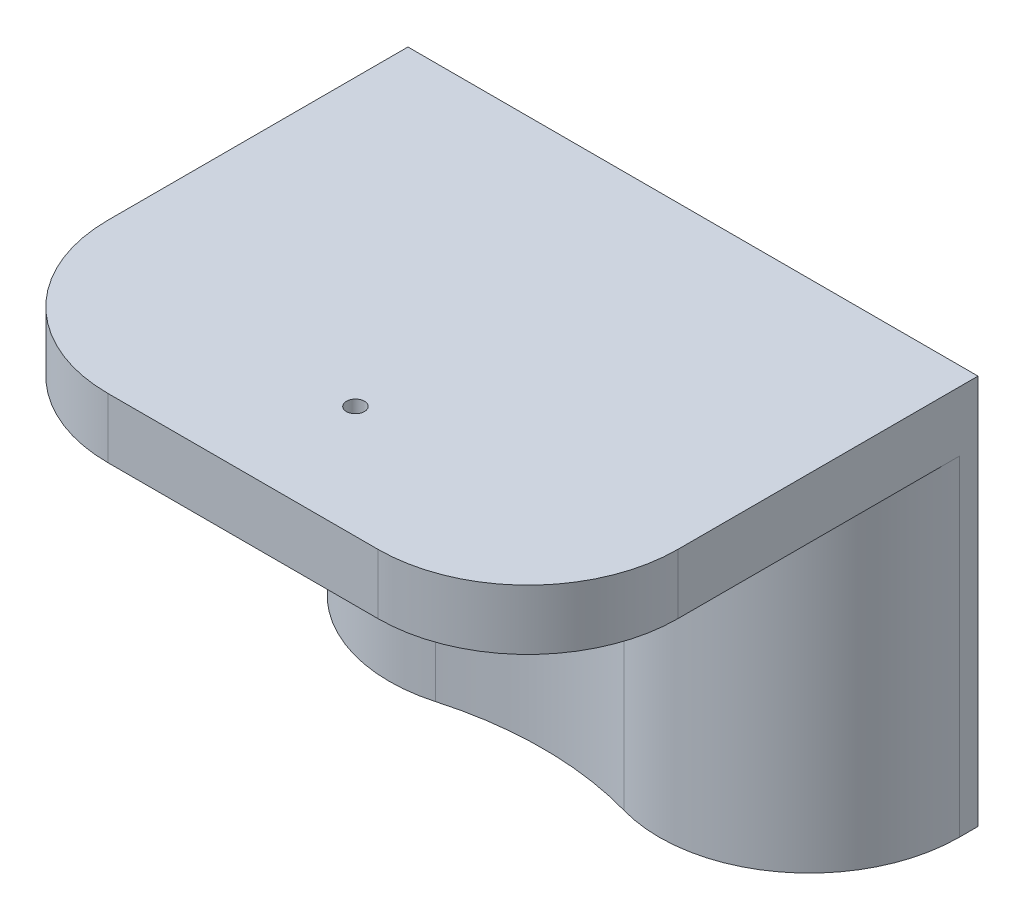
ISO-10303-21;
HEADER;
FILE_DESCRIPTION(('STEP AP214'),'2;1');
FILE_NAME('part.step','',(''),(''),'','','');
FILE_SCHEMA(('AUTOMOTIVE_DESIGN { 1 0 10303 214 1 1 1 1 }'));
ENDSEC;
DATA;
#1=APPLICATION_CONTEXT('core data for automotive mechanical design processes');
#2=APPLICATION_PROTOCOL_DEFINITION('international standard','automotive_design',2000,#1);
#3=PRODUCT_CONTEXT('',#1,'mechanical');
#4=PRODUCT('Part','Part','',(#3));
#5=PRODUCT_RELATED_PRODUCT_CATEGORY('part','',(#4));
#6=PRODUCT_DEFINITION_FORMATION('','',#4);
#7=PRODUCT_DEFINITION_CONTEXT('part definition',#1,'design');
#8=PRODUCT_DEFINITION('design','',#6,#7);
#9=PRODUCT_DEFINITION_SHAPE('','',#8);
#10=(LENGTH_UNIT() NAMED_UNIT(*) SI_UNIT(.MILLI.,.METRE.));
#11=(NAMED_UNIT(*) PLANE_ANGLE_UNIT() SI_UNIT($,.RADIAN.));
#12=(NAMED_UNIT(*) SI_UNIT($,.STERADIAN.) SOLID_ANGLE_UNIT());
#13=UNCERTAINTY_MEASURE_WITH_UNIT(LENGTH_MEASURE(1.E-05),#10,'distance_accuracy_value','');
#14=(GEOMETRIC_REPRESENTATION_CONTEXT(3) GLOBAL_UNCERTAINTY_ASSIGNED_CONTEXT((#13)) GLOBAL_UNIT_ASSIGNED_CONTEXT((#10,
#11,#12)) REPRESENTATION_CONTEXT('',''));
#15=CARTESIAN_POINT('',(0.,0.,0.));
#16=DIRECTION('',(0.,0.,1.));
#17=DIRECTION('',(1.,0.,0.));
#18=AXIS2_PLACEMENT_3D('',#15,#16,#17);
#19=CARTESIAN_POINT('',(-33.1070823408573,4.,37.625158927755));
#20=DIRECTION('',(0.,-1.,0.));
#21=DIRECTION('',(0.,0.,-1.));
#22=AXIS2_PLACEMENT_3D('',#19,#20,#21);
#23=PLANE('',#22);
#24=DIRECTION('',(0.,0.,1.));
#25=VECTOR('',#24,1.);
#26=CARTESIAN_POINT('',(-43.1070823408573,4.,17.625158927755));
#27=LINE('',#26,#25);
#28=CARTESIAN_POINT('',(-43.1070823408573,4.,17.625158927755));
#29=VERTEX_POINT('',#28);
#30=CARTESIAN_POINT('',(-43.1070823408573,4.,37.625158927755));
#31=VERTEX_POINT('',#30);
#32=EDGE_CURVE('E127',#29,#31,#27,.T.);
#33=ORIENTED_EDGE('',*,*,#32,.T.);
#34=CARTESIAN_POINT('',(-33.1070823408573,4.,37.625158927755));
#35=DIRECTION('',(0.,1.,0.));
#36=DIRECTION('',(0.,0.,-1.));
#37=AXIS2_PLACEMENT_3D('',#34,#35,#36);
#38=CIRCLE('',#37,10.);
#39=CARTESIAN_POINT('',(-33.1070823408572,4.,47.625158927755));
#40=VERTEX_POINT('',#39);
#41=EDGE_CURVE('E150',#31,#40,#38,.T.);
#42=ORIENTED_EDGE('',*,*,#41,.T.);
#43=DIRECTION('',(1.,0.,0.));
#44=VECTOR('',#43,1.);
#45=CARTESIAN_POINT('',(-33.1070823408572,4.,47.625158927755));
#46=LINE('',#45,#44);
#47=CARTESIAN_POINT('',(-15.1070823408574,4.,47.625158927755));
#48=VERTEX_POINT('',#47);
#49=EDGE_CURVE('E153',#40,#48,#46,.T.);
#50=ORIENTED_EDGE('',*,*,#49,.T.);
#51=CARTESIAN_POINT('',(-15.1070823408573,4.,37.625158927755));
#52=DIRECTION('',(0.,1.,0.));
#53=DIRECTION('',(0.,0.,1.));
#54=AXIS2_PLACEMENT_3D('',#51,#52,#53);
#55=CIRCLE('',#54,10.);
#56=CARTESIAN_POINT('',(-5.10708234085731,4.,37.625158927755));
#57=VERTEX_POINT('',#56);
#58=EDGE_CURVE('E155',#48,#57,#55,.T.);
#59=ORIENTED_EDGE('',*,*,#58,.T.);
#60=DIRECTION('',(0.,0.,-1.));
#61=VECTOR('',#60,1.);
#62=CARTESIAN_POINT('',(-5.10708234085731,4.,17.625158927755));
#63=LINE('',#62,#61);
#64=CARTESIAN_POINT('',(-5.10708234085731,4.,17.625158927755));
#65=VERTEX_POINT('',#64);
#66=EDGE_CURVE('E157',#57,#65,#63,.T.);
#67=ORIENTED_EDGE('',*,*,#66,.T.);
#68=DIRECTION('',(-1.,0.,0.));
#69=VECTOR('',#68,1.);
#70=CARTESIAN_POINT('',(-43.1070823408573,4.,17.625158927755));
#71=LINE('',#70,#69);
#72=EDGE_CURVE('E131',#65,#29,#71,.T.);
#73=ORIENTED_EDGE('',*,*,#72,.T.);
#74=EDGE_LOOP('',(#33,#42,#50,#59,#67,#73));
#75=FACE_BOUND('',#74,.T.);
#76=CARTESIAN_POINT('',(-24.1070823408573,4.,40.125158927755));
#77=DIRECTION('',(0.,1.,0.));
#78=DIRECTION('',(0.,0.,1.));
#79=AXIS2_PLACEMENT_3D('',#76,#77,#78);
#80=CIRCLE('',#79,0.600000000000001);
#81=CARTESIAN_POINT('',(-24.1070823408573,4.,40.725158927755));
#82=VERTEX_POINT('',#81);
#83=EDGE_CURVE('E143',#82,#82,#80,.T.);
#84=ORIENTED_EDGE('',*,*,#83,.F.);
#85=EDGE_LOOP('',(#84));
#86=FACE_BOUND('',#85,.T.);
#87=ADVANCED_FACE('F33',(#75,#86),#23,.F.);
#88=CARTESIAN_POINT('',(-33.1070823408573,0.,37.625158927755));
#89=DIRECTION('',(0.,-1.,0.));
#90=DIRECTION('',(0.,0.,-1.));
#91=AXIS2_PLACEMENT_3D('',#88,#89,#90);
#92=PLANE('',#91);
#93=CARTESIAN_POINT('',(-24.1070823408573,0.,50.675158927755));
#94=DIRECTION('',(0.,1.,0.));
#95=DIRECTION('',(0.,0.,-1.));
#96=AXIS2_PLACEMENT_3D('',#93,#94,#95);
#97=CIRCLE('',#96,23.05);
#98=CARTESIAN_POINT('',(-17.8302290882098,0.,28.4962587466205));
#99=VERTEX_POINT('',#98);
#100=CARTESIAN_POINT('',(-30.3839355935048,0.,28.4962587466205));
#101=VERTEX_POINT('',#100);
#102=EDGE_CURVE('E119',#99,#101,#97,.T.);
#103=ORIENTED_EDGE('',*,*,#102,.F.);
#104=CARTESIAN_POINT('',(-15.1070823408573,0.,18.8741762385361));
#105=DIRECTION('',(0.,-1.,0.));
#106=DIRECTION('',(0.,0.,-1.));
#107=AXIS2_PLACEMENT_3D('',#104,#105,#106);
#108=CIRCLE('',#107,10.);
#109=CARTESIAN_POINT('',(-5.10708234085731,0.,18.8741762385361));
#110=VERTEX_POINT('',#109);
#111=EDGE_CURVE('E11',#99,#110,#108,.F.);
#112=ORIENTED_EDGE('',*,*,#111,.T.);
#113=DIRECTION('',(0.,0.,-1.));
#114=VECTOR('',#113,1.);
#115=CARTESIAN_POINT('',(-5.10708234085731,0.,37.625158927755));
#116=LINE('',#115,#114);
#117=CARTESIAN_POINT('',(-5.10708234085731,0.,37.625158927755));
#118=VERTEX_POINT('',#117);
#119=EDGE_CURVE('E47',#118,#110,#116,.T.);
#120=ORIENTED_EDGE('',*,*,#119,.F.);
#121=CARTESIAN_POINT('',(-15.1070823408573,0.,37.625158927755));
#122=DIRECTION('',(0.,1.,0.));
#123=DIRECTION('',(0.,0.,1.));
#124=AXIS2_PLACEMENT_3D('',#121,#122,#123);
#125=CIRCLE('',#124,10.);
#126=CARTESIAN_POINT('',(-15.1070823408574,0.,47.625158927755));
#127=VERTEX_POINT('',#126);
#128=EDGE_CURVE('E151',#127,#118,#125,.T.);
#129=ORIENTED_EDGE('',*,*,#128,.F.);
#130=DIRECTION('',(1.,0.,0.));
#131=VECTOR('',#130,1.);
#132=CARTESIAN_POINT('',(-33.1070823408572,0.,47.625158927755));
#133=LINE('',#132,#131);
#134=CARTESIAN_POINT('',(-33.1070823408572,0.,47.625158927755));
#135=VERTEX_POINT('',#134);
#136=EDGE_CURVE('E161',#135,#127,#133,.T.);
#137=ORIENTED_EDGE('',*,*,#136,.F.);
#138=CARTESIAN_POINT('',(-33.1070823408573,0.,37.625158927755));
#139=DIRECTION('',(0.,1.,0.));
#140=DIRECTION('',(0.,0.,-1.));
#141=AXIS2_PLACEMENT_3D('',#138,#139,#140);
#142=CIRCLE('',#141,10.);
#143=CARTESIAN_POINT('',(-43.1070823408573,0.,37.625158927755));
#144=VERTEX_POINT('',#143);
#145=EDGE_CURVE('E146',#144,#135,#142,.T.);
#146=ORIENTED_EDGE('',*,*,#145,.F.);
#147=DIRECTION('',(0.,0.,1.));
#148=VECTOR('',#147,1.);
#149=CARTESIAN_POINT('',(-43.1070823408573,0.,37.625158927755));
#150=LINE('',#149,#148);
#151=CARTESIAN_POINT('',(-43.1070823408573,0.,18.8741762385361));
#152=VERTEX_POINT('',#151);
#153=EDGE_CURVE('E177',#152,#144,#150,.T.);
#154=ORIENTED_EDGE('',*,*,#153,.F.);
#155=CARTESIAN_POINT('',(-33.1070823408573,0.,18.8741762385361));
#156=DIRECTION('',(0.,-1.,0.));
#157=DIRECTION('',(0.,0.,-1.));
#158=AXIS2_PLACEMENT_3D('',#155,#156,#157);
#159=CIRCLE('',#158,10.);
#160=EDGE_CURVE('E185',#152,#101,#159,.F.);
#161=ORIENTED_EDGE('',*,*,#160,.T.);
#162=EDGE_LOOP('',(#103,#112,#120,#129,#137,#146,#154,#161));
#163=FACE_BOUND('',#162,.T.);
#164=CARTESIAN_POINT('',(-24.1070823408573,0.,40.125158927755));
#165=DIRECTION('',(0.,1.,0.));
#166=DIRECTION('',(0.,0.,1.));
#167=AXIS2_PLACEMENT_3D('',#164,#165,#166);
#168=CIRCLE('',#167,0.600000000000001);
#169=CARTESIAN_POINT('',(-24.1070823408573,0.,40.725158927755));
#170=VERTEX_POINT('',#169);
#171=EDGE_CURVE('E141',#170,#170,#168,.T.);
#172=ORIENTED_EDGE('',*,*,#171,.T.);
#173=EDGE_LOOP('',(#172));
#174=FACE_BOUND('',#173,.T.);
#175=ADVANCED_FACE('F210',(#163,#174),#92,.T.);
#176=CARTESIAN_POINT('',(-43.1070823408573,4.,17.625158927755));
#177=DIRECTION('',(1.,0.,0.));
#178=DIRECTION('',(0.,0.,-1.));
#179=AXIS2_PLACEMENT_3D('',#176,#177,#178);
#180=PLANE('',#179);
#181=DIRECTION('',(0.,0.,-1.));
#182=VECTOR('',#181,1.);
#183=CARTESIAN_POINT('',(-43.1070823408573,-22.,17.625158927755));
#184=LINE('',#183,#182);
#185=CARTESIAN_POINT('',(-43.1070823408573,-22.,18.8741762385361));
#186=VERTEX_POINT('',#185);
#187=CARTESIAN_POINT('',(-43.1070823408573,-22.,17.625158927755));
#188=VERTEX_POINT('',#187);
#189=EDGE_CURVE('E107',#186,#188,#184,.T.);
#190=ORIENTED_EDGE('',*,*,#189,.F.);
#191=DIRECTION('',(0.,1.,0.));
#192=VECTOR('',#191,1.);
#193=CARTESIAN_POINT('',(-43.1070823408573,4.,18.8741762385361));
#194=LINE('',#193,#192);
#195=EDGE_CURVE('E179',#186,#152,#194,.T.);
#196=ORIENTED_EDGE('',*,*,#195,.T.);
#197=ORIENTED_EDGE('',*,*,#153,.T.);
#198=DIRECTION('',(0.,-1.,0.));
#199=VECTOR('',#198,1.);
#200=CARTESIAN_POINT('',(-43.1070823408573,4.,37.625158927755));
#201=LINE('',#200,#199);
#202=EDGE_CURVE('E174',#31,#144,#201,.T.);
#203=ORIENTED_EDGE('',*,*,#202,.F.);
#204=ORIENTED_EDGE('',*,*,#32,.F.);
#205=DIRECTION('',(0.,-1.,0.));
#206=VECTOR('',#205,1.);
#207=CARTESIAN_POINT('',(-43.1070823408573,4.,17.625158927755));
#208=LINE('',#207,#206);
#209=EDGE_CURVE('E123',#29,#188,#208,.T.);
#210=ORIENTED_EDGE('',*,*,#209,.T.);
#211=EDGE_LOOP('',(#190,#196,#197,#203,#204,#210));
#212=FACE_BOUND('',#211,.T.);
#213=ADVANCED_FACE('F124',(#212),#180,.F.);
#214=CARTESIAN_POINT('',(-33.1070823408573,4.,37.625158927755));
#215=DIRECTION('',(0.,-1.,0.));
#216=DIRECTION('',(0.,0.,-1.));
#217=AXIS2_PLACEMENT_3D('',#214,#215,#216);
#218=CYLINDRICAL_SURFACE('',#217,10.);
#219=ORIENTED_EDGE('',*,*,#145,.T.);
#220=DIRECTION('',(0.,-1.,0.));
#221=VECTOR('',#220,1.);
#222=CARTESIAN_POINT('',(-33.1070823408572,4.,47.625158927755));
#223=LINE('',#222,#221);
#224=EDGE_CURVE('E171',#40,#135,#223,.T.);
#225=ORIENTED_EDGE('',*,*,#224,.F.);
#226=ORIENTED_EDGE('',*,*,#41,.F.);
#227=ORIENTED_EDGE('',*,*,#202,.T.);
#228=EDGE_LOOP('',(#219,#225,#226,#227));
#229=FACE_BOUND('',#228,.T.);
#230=ADVANCED_FACE('F219',(#229),#218,.T.);
#231=CARTESIAN_POINT('',(-33.1070823408572,4.,47.625158927755));
#232=DIRECTION('',(0.,0.,-1.));
#233=DIRECTION('',(-1.,0.,0.));
#234=AXIS2_PLACEMENT_3D('',#231,#232,#233);
#235=PLANE('',#234);
#236=ORIENTED_EDGE('',*,*,#136,.T.);
#237=DIRECTION('',(0.,-1.,0.));
#238=VECTOR('',#237,1.);
#239=CARTESIAN_POINT('',(-15.1070823408574,4.,47.625158927755));
#240=LINE('',#239,#238);
#241=EDGE_CURVE('E168',#48,#127,#240,.T.);
#242=ORIENTED_EDGE('',*,*,#241,.F.);
#243=ORIENTED_EDGE('',*,*,#49,.F.);
#244=ORIENTED_EDGE('',*,*,#224,.T.);
#245=EDGE_LOOP('',(#236,#242,#243,#244));
#246=FACE_BOUND('',#245,.T.);
#247=ADVANCED_FACE('F215',(#246),#235,.F.);
#248=CARTESIAN_POINT('',(-15.1070823408573,4.,37.625158927755));
#249=DIRECTION('',(0.,-1.,0.));
#250=DIRECTION('',(0.,0.,-1.));
#251=AXIS2_PLACEMENT_3D('',#248,#249,#250);
#252=CYLINDRICAL_SURFACE('',#251,10.);
#253=ORIENTED_EDGE('',*,*,#128,.T.);
#254=DIRECTION('',(0.,-1.,0.));
#255=VECTOR('',#254,1.);
#256=CARTESIAN_POINT('',(-5.10708234085731,4.,37.625158927755));
#257=LINE('',#256,#255);
#258=EDGE_CURVE('E166',#57,#118,#257,.T.);
#259=ORIENTED_EDGE('',*,*,#258,.F.);
#260=ORIENTED_EDGE('',*,*,#58,.F.);
#261=ORIENTED_EDGE('',*,*,#241,.T.);
#262=EDGE_LOOP('',(#253,#259,#260,#261));
#263=FACE_BOUND('',#262,.T.);
#264=ADVANCED_FACE('F207',(#263),#252,.T.);
#265=CARTESIAN_POINT('',(-5.10708234085731,4.,17.625158927755));
#266=DIRECTION('',(-1.,0.,0.));
#267=DIRECTION('',(0.,0.,1.));
#268=AXIS2_PLACEMENT_3D('',#265,#266,#267);
#269=PLANE('',#268);
#270=ORIENTED_EDGE('',*,*,#258,.T.);
#271=ORIENTED_EDGE('',*,*,#119,.T.);
#272=DIRECTION('',(0.,1.,0.));
#273=VECTOR('',#272,1.);
#274=CARTESIAN_POINT('',(-5.10708234085731,4.,18.8741762385361));
#275=LINE('',#274,#273);
#276=CARTESIAN_POINT('',(-5.10708234085731,-22.,18.8741762385361));
#277=VERTEX_POINT('',#276);
#278=EDGE_CURVE('E191',#110,#277,#275,.F.);
#279=ORIENTED_EDGE('',*,*,#278,.T.);
#280=DIRECTION('',(0.,0.,1.));
#281=VECTOR('',#280,1.);
#282=CARTESIAN_POINT('',(-5.10708234085731,-22.,17.625158927755));
#283=LINE('',#282,#281);
#284=CARTESIAN_POINT('',(-5.10708234085731,-22.,17.625158927755));
#285=VERTEX_POINT('',#284);
#286=EDGE_CURVE('E135',#285,#277,#283,.T.);
#287=ORIENTED_EDGE('',*,*,#286,.F.);
#288=DIRECTION('',(0.,-1.,0.));
#289=VECTOR('',#288,1.);
#290=CARTESIAN_POINT('',(-5.10708234085731,4.,17.625158927755));
#291=LINE('',#290,#289);
#292=EDGE_CURVE('E130',#65,#285,#291,.T.);
#293=ORIENTED_EDGE('',*,*,#292,.F.);
#294=ORIENTED_EDGE('',*,*,#66,.F.);
#295=EDGE_LOOP('',(#270,#271,#279,#287,#293,#294));
#296=FACE_BOUND('',#295,.T.);
#297=ADVANCED_FACE('F202',(#296),#269,.F.);
#298=CARTESIAN_POINT('',(-43.1070823408573,4.,17.625158927755));
#299=DIRECTION('',(0.,0.,1.));
#300=DIRECTION('',(1.,0.,0.));
#301=AXIS2_PLACEMENT_3D('',#298,#299,#300);
#302=PLANE('',#301);
#303=ORIENTED_EDGE('',*,*,#292,.T.);
#304=DIRECTION('',(1.,0.,0.));
#305=VECTOR('',#304,1.);
#306=CARTESIAN_POINT('',(-43.1070823408573,-22.,17.625158927755));
#307=LINE('',#306,#305);
#308=EDGE_CURVE('E112',#188,#285,#307,.T.);
#309=ORIENTED_EDGE('',*,*,#308,.F.);
#310=ORIENTED_EDGE('',*,*,#209,.F.);
#311=ORIENTED_EDGE('',*,*,#72,.F.);
#312=EDGE_LOOP('',(#303,#309,#310,#311));
#313=FACE_BOUND('',#312,.T.);
#314=ADVANCED_FACE('F133',(#313),#302,.F.);
#315=CARTESIAN_POINT('',(-24.1070823408573,4.,40.125158927755));
#316=DIRECTION('',(0.,-1.,0.));
#317=DIRECTION('',(0.,0.,-1.));
#318=AXIS2_PLACEMENT_3D('',#315,#316,#317);
#319=CYLINDRICAL_SURFACE('',#318,0.600000000000001);
#320=ORIENTED_EDGE('',*,*,#83,.T.);
#321=EDGE_LOOP('',(#320));
#322=FACE_BOUND('',#321,.T.);
#323=ORIENTED_EDGE('',*,*,#171,.F.);
#324=EDGE_LOOP('',(#323));
#325=FACE_BOUND('',#324,.T.);
#326=ADVANCED_FACE('F238',(#322,#325),#319,.F.);
#327=CARTESIAN_POINT('',(-24.1070823408573,-22.,50.675158927755));
#328=DIRECTION('',(0.,1.,0.));
#329=DIRECTION('',(0.,0.,1.));
#330=AXIS2_PLACEMENT_3D('',#327,#328,#329);
#331=CYLINDRICAL_SURFACE('',#330,23.05);
#332=CARTESIAN_POINT('',(-24.1070823408573,-22.,50.675158927755));
#333=DIRECTION('',(0.,1.,0.));
#334=DIRECTION('',(0.,0.,-1.));
#335=AXIS2_PLACEMENT_3D('',#332,#333,#334);
#336=CIRCLE('',#335,23.05);
#337=CARTESIAN_POINT('',(-17.8302290882098,-22.,28.4962587466205));
#338=VERTEX_POINT('',#337);
#339=CARTESIAN_POINT('',(-30.3839355935048,-22.,28.4962587466205));
#340=VERTEX_POINT('',#339);
#341=EDGE_CURVE('E137',#338,#340,#336,.T.);
#342=ORIENTED_EDGE('',*,*,#341,.F.);
#343=DIRECTION('',(0.,1.,0.));
#344=VECTOR('',#343,1.);
#345=CARTESIAN_POINT('',(-17.8302290882098,-22.,28.4962587466205));
#346=LINE('',#345,#344);
#347=EDGE_CURVE('E188',#338,#99,#346,.T.);
#348=ORIENTED_EDGE('',*,*,#347,.T.);
#349=ORIENTED_EDGE('',*,*,#102,.T.);
#350=DIRECTION('',(0.,1.,0.));
#351=VECTOR('',#350,1.);
#352=CARTESIAN_POINT('',(-30.3839355935048,-22.,28.4962587466205));
#353=LINE('',#352,#351);
#354=EDGE_CURVE('E181',#101,#340,#353,.F.);
#355=ORIENTED_EDGE('',*,*,#354,.T.);
#356=EDGE_LOOP('',(#342,#348,#349,#355));
#357=FACE_BOUND('',#356,.T.);
#358=ADVANCED_FACE('F199',(#357),#331,.F.);
#359=CARTESIAN_POINT('',(-24.1070823408573,-22.,50.675158927755));
#360=DIRECTION('',(0.,-1.,0.));
#361=DIRECTION('',(0.,0.,-1.));
#362=AXIS2_PLACEMENT_3D('',#359,#360,#361);
#363=PLANE('',#362);
#364=ORIENTED_EDGE('',*,*,#286,.T.);
#365=CARTESIAN_POINT('',(-15.1070823408573,-22.,18.8741762385361));
#366=DIRECTION('',(0.,-1.,0.));
#367=DIRECTION('',(0.,0.,-1.));
#368=AXIS2_PLACEMENT_3D('',#365,#366,#367);
#369=CIRCLE('',#368,10.);
#370=EDGE_CURVE('E41',#277,#338,#369,.T.);
#371=ORIENTED_EDGE('',*,*,#370,.T.);
#372=ORIENTED_EDGE('',*,*,#341,.T.);
#373=CARTESIAN_POINT('',(-33.1070823408573,-22.,18.8741762385361));
#374=DIRECTION('',(0.,-1.,0.));
#375=DIRECTION('',(0.,0.,-1.));
#376=AXIS2_PLACEMENT_3D('',#373,#374,#375);
#377=CIRCLE('',#376,10.);
#378=EDGE_CURVE('E115',#340,#186,#377,.T.);
#379=ORIENTED_EDGE('',*,*,#378,.T.);
#380=ORIENTED_EDGE('',*,*,#189,.T.);
#381=ORIENTED_EDGE('',*,*,#308,.T.);
#382=EDGE_LOOP('',(#364,#371,#372,#379,#380,#381));
#383=FACE_BOUND('',#382,.T.);
#384=ADVANCED_FACE('F110',(#383),#363,.T.);
#385=CARTESIAN_POINT('',(-33.1070823408573,-22.,18.8741762385361));
#386=DIRECTION('',(0.,1.,0.));
#387=DIRECTION('',(0.,0.,1.));
#388=AXIS2_PLACEMENT_3D('',#385,#386,#387);
#389=CYLINDRICAL_SURFACE('',#388,10.);
#390=ORIENTED_EDGE('',*,*,#378,.F.);
#391=ORIENTED_EDGE('',*,*,#354,.F.);
#392=ORIENTED_EDGE('',*,*,#160,.F.);
#393=ORIENTED_EDGE('',*,*,#195,.F.);
#394=EDGE_LOOP('',(#390,#391,#392,#393));
#395=FACE_BOUND('',#394,.T.);
#396=ADVANCED_FACE('F221',(#395),#389,.T.);
#397=CARTESIAN_POINT('',(-15.1070823408573,-22.,18.8741762385361));
#398=DIRECTION('',(0.,1.,0.));
#399=DIRECTION('',(0.,0.,1.));
#400=AXIS2_PLACEMENT_3D('',#397,#398,#399);
#401=CYLINDRICAL_SURFACE('',#400,10.);
#402=ORIENTED_EDGE('',*,*,#370,.F.);
#403=ORIENTED_EDGE('',*,*,#278,.F.);
#404=ORIENTED_EDGE('',*,*,#111,.F.);
#405=ORIENTED_EDGE('',*,*,#347,.F.);
#406=EDGE_LOOP('',(#402,#403,#404,#405));
#407=FACE_BOUND('',#406,.T.);
#408=ADVANCED_FACE('F35',(#407),#401,.T.);
#409=CLOSED_SHELL('',(#87,#175,#213,#230,#247,#264,#297,#314,#326,#358,#384,#396,#408));
#410=MANIFOLD_SOLID_BREP('B2',#409);
#411=ADVANCED_BREP_SHAPE_REPRESENTATION('',(#18,#410),#14);
#412=SHAPE_DEFINITION_REPRESENTATION(#9,#411);
ENDSEC;
END-ISO-10303-21;
